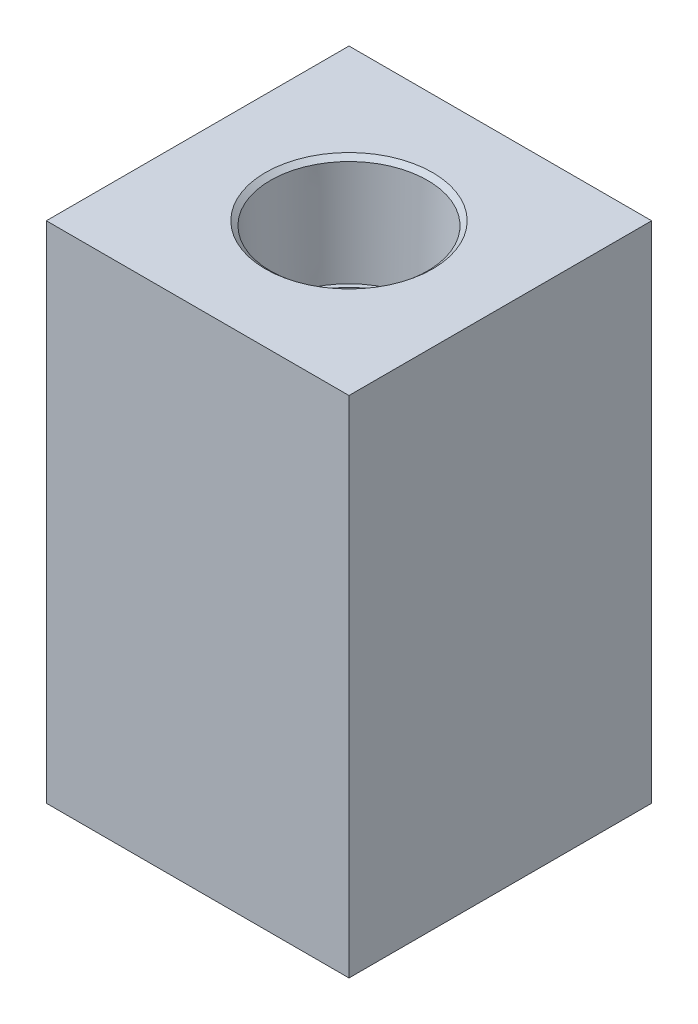
ISO-10303-21;
HEADER;
FILE_DESCRIPTION(('STEP AP214'),'2;1');
FILE_NAME('part.step','',(''),(''),'','','');
FILE_SCHEMA(('AUTOMOTIVE_DESIGN { 1 0 10303 214 1 1 1 1 }'));
ENDSEC;
DATA;
#1=APPLICATION_CONTEXT('core data for automotive mechanical design processes');
#2=APPLICATION_PROTOCOL_DEFINITION('international standard','automotive_design',2000,#1);
#3=PRODUCT_CONTEXT('',#1,'mechanical');
#4=PRODUCT('Part','Part','',(#3));
#5=PRODUCT_RELATED_PRODUCT_CATEGORY('part','',(#4));
#6=PRODUCT_DEFINITION_FORMATION('','',#4);
#7=PRODUCT_DEFINITION_CONTEXT('part definition',#1,'design');
#8=PRODUCT_DEFINITION('design','',#6,#7);
#9=PRODUCT_DEFINITION_SHAPE('','',#8);
#10=(LENGTH_UNIT() NAMED_UNIT(*) SI_UNIT(.MILLI.,.METRE.));
#11=(NAMED_UNIT(*) PLANE_ANGLE_UNIT() SI_UNIT($,.RADIAN.));
#12=(NAMED_UNIT(*) SI_UNIT($,.STERADIAN.) SOLID_ANGLE_UNIT());
#13=UNCERTAINTY_MEASURE_WITH_UNIT(LENGTH_MEASURE(1.E-05),#10,'distance_accuracy_value','');
#14=(GEOMETRIC_REPRESENTATION_CONTEXT(3) GLOBAL_UNCERTAINTY_ASSIGNED_CONTEXT((#13)) GLOBAL_UNIT_ASSIGNED_CONTEXT((#10,
#11,#12)) REPRESENTATION_CONTEXT('',''));
#15=CARTESIAN_POINT('',(0.,0.,0.));
#16=DIRECTION('',(0.,0.,1.));
#17=DIRECTION('',(1.,0.,0.));
#18=AXIS2_PLACEMENT_3D('',#15,#16,#17);
#19=CARTESIAN_POINT('',(-19.05,63.5,-19.05));
#20=DIRECTION('',(1.,0.,0.));
#21=DIRECTION('',(0.,0.,-1.));
#22=AXIS2_PLACEMENT_3D('',#19,#20,#21);
#23=PLANE('',#22);
#24=DIRECTION('',(0.,0.,1.));
#25=VECTOR('',#24,1.);
#26=CARTESIAN_POINT('',(-19.05,0.,-19.05));
#27=LINE('',#26,#25);
#28=CARTESIAN_POINT('',(-19.05,0.,-19.05));
#29=VERTEX_POINT('',#28);
#30=CARTESIAN_POINT('',(-19.05,0.,19.05));
#31=VERTEX_POINT('',#30);
#32=EDGE_CURVE('E123',#29,#31,#27,.T.);
#33=ORIENTED_EDGE('',*,*,#32,.T.);
#34=DIRECTION('',(0.,-1.,0.));
#35=VECTOR('',#34,1.);
#36=CARTESIAN_POINT('',(-19.05,63.5,19.05));
#37=LINE('',#36,#35);
#38=CARTESIAN_POINT('',(-19.05,63.5,19.05));
#39=VERTEX_POINT('',#38);
#40=EDGE_CURVE('E11',#39,#31,#37,.T.);
#41=ORIENTED_EDGE('',*,*,#40,.F.);
#42=DIRECTION('',(0.,0.,1.));
#43=VECTOR('',#42,1.);
#44=CARTESIAN_POINT('',(-19.05,63.5,-19.05));
#45=LINE('',#44,#43);
#46=CARTESIAN_POINT('',(-19.05,63.5,-19.05));
#47=VERTEX_POINT('',#46);
#48=EDGE_CURVE('E104',#47,#39,#45,.T.);
#49=ORIENTED_EDGE('',*,*,#48,.F.);
#50=DIRECTION('',(0.,-1.,0.));
#51=VECTOR('',#50,1.);
#52=CARTESIAN_POINT('',(-19.05,63.5,-19.05));
#53=LINE('',#52,#51);
#54=EDGE_CURVE('E71',#47,#29,#53,.T.);
#55=ORIENTED_EDGE('',*,*,#54,.T.);
#56=EDGE_LOOP('',(#33,#41,#49,#55));
#57=FACE_BOUND('',#56,.T.);
#58=ADVANCED_FACE('F48',(#57),#23,.F.);
#59=CARTESIAN_POINT('',(-19.05,63.5,19.05));
#60=DIRECTION('',(0.,0.,-1.));
#61=DIRECTION('',(-1.,0.,0.));
#62=AXIS2_PLACEMENT_3D('',#59,#60,#61);
#63=PLANE('',#62);
#64=DIRECTION('',(1.,0.,0.));
#65=VECTOR('',#64,1.);
#66=CARTESIAN_POINT('',(-19.05,0.,19.05));
#67=LINE('',#66,#65);
#68=CARTESIAN_POINT('',(19.05,0.,19.05));
#69=VERTEX_POINT('',#68);
#70=EDGE_CURVE('E110',#31,#69,#67,.T.);
#71=ORIENTED_EDGE('',*,*,#70,.T.);
#72=DIRECTION('',(0.,-1.,0.));
#73=VECTOR('',#72,1.);
#74=CARTESIAN_POINT('',(19.05,63.5,19.05));
#75=LINE('',#74,#73);
#76=CARTESIAN_POINT('',(19.05,63.5,19.05));
#77=VERTEX_POINT('',#76);
#78=EDGE_CURVE('E63',#77,#69,#75,.T.);
#79=ORIENTED_EDGE('',*,*,#78,.F.);
#80=DIRECTION('',(1.,0.,0.));
#81=VECTOR('',#80,1.);
#82=CARTESIAN_POINT('',(-19.05,63.5,19.05));
#83=LINE('',#82,#81);
#84=EDGE_CURVE('E96',#39,#77,#83,.T.);
#85=ORIENTED_EDGE('',*,*,#84,.F.);
#86=ORIENTED_EDGE('',*,*,#40,.T.);
#87=EDGE_LOOP('',(#71,#79,#85,#86));
#88=FACE_BOUND('',#87,.T.);
#89=ADVANCED_FACE('F109',(#88),#63,.F.);
#90=CARTESIAN_POINT('',(19.05,63.5,-19.05));
#91=DIRECTION('',(1.,0.,0.));
#92=DIRECTION('',(0.,0.,-1.));
#93=AXIS2_PLACEMENT_3D('',#90,#91,#92);
#94=PLANE('',#93);
#95=DIRECTION('',(0.,0.,1.));
#96=VECTOR('',#95,1.);
#97=CARTESIAN_POINT('',(19.05,0.,-19.05));
#98=LINE('',#97,#96);
#99=CARTESIAN_POINT('',(19.05,0.,-19.05));
#100=VERTEX_POINT('',#99);
#101=EDGE_CURVE('E129',#100,#69,#98,.T.);
#102=ORIENTED_EDGE('',*,*,#101,.F.);
#103=DIRECTION('',(0.,-1.,0.));
#104=VECTOR('',#103,1.);
#105=CARTESIAN_POINT('',(19.05,63.5,-19.05));
#106=LINE('',#105,#104);
#107=CARTESIAN_POINT('',(19.05,63.5,-19.05));
#108=VERTEX_POINT('',#107);
#109=EDGE_CURVE('E85',#108,#100,#106,.T.);
#110=ORIENTED_EDGE('',*,*,#109,.F.);
#111=DIRECTION('',(0.,0.,1.));
#112=VECTOR('',#111,1.);
#113=CARTESIAN_POINT('',(19.05,63.5,-19.05));
#114=LINE('',#113,#112);
#115=EDGE_CURVE('E103',#108,#77,#114,.T.);
#116=ORIENTED_EDGE('',*,*,#115,.T.);
#117=ORIENTED_EDGE('',*,*,#78,.T.);
#118=EDGE_LOOP('',(#102,#110,#116,#117));
#119=FACE_BOUND('',#118,.T.);
#120=ADVANCED_FACE('F115',(#119),#94,.T.);
#121=CARTESIAN_POINT('',(-19.05,63.5,-19.05));
#122=DIRECTION('',(0.,0.,-1.));
#123=DIRECTION('',(-1.,0.,0.));
#124=AXIS2_PLACEMENT_3D('',#121,#122,#123);
#125=PLANE('',#124);
#126=DIRECTION('',(1.,0.,0.));
#127=VECTOR('',#126,1.);
#128=CARTESIAN_POINT('',(-19.05,0.,-19.05));
#129=LINE('',#128,#127);
#130=EDGE_CURVE('E132',#29,#100,#129,.T.);
#131=ORIENTED_EDGE('',*,*,#130,.F.);
#132=ORIENTED_EDGE('',*,*,#54,.F.);
#133=DIRECTION('',(1.,0.,0.));
#134=VECTOR('',#133,1.);
#135=CARTESIAN_POINT('',(-19.05,63.5,-19.05));
#136=LINE('',#135,#134);
#137=EDGE_CURVE('E117',#47,#108,#136,.T.);
#138=ORIENTED_EDGE('',*,*,#137,.T.);
#139=ORIENTED_EDGE('',*,*,#109,.T.);
#140=EDGE_LOOP('',(#131,#132,#138,#139));
#141=FACE_BOUND('',#140,.T.);
#142=ADVANCED_FACE('F210',(#141),#125,.T.);
#143=CARTESIAN_POINT('',(0.,63.5,0.));
#144=DIRECTION('',(0.,1.,0.));
#145=DIRECTION('',(0.,0.,1.));
#146=AXIS2_PLACEMENT_3D('',#143,#144,#145);
#147=PLANE('',#146);
#148=CARTESIAN_POINT('',(0.,63.5,0.));
#149=DIRECTION('',(0.,1.,0.));
#150=DIRECTION('',(0.,0.,1.));
#151=AXIS2_PLACEMENT_3D('',#148,#149,#150);
#152=CIRCLE('',#151,10.5210229);
#153=CARTESIAN_POINT('',(0.,63.5,10.5210229));
#154=VERTEX_POINT('',#153);
#155=EDGE_CURVE('E157',#154,#154,#152,.T.);
#156=ORIENTED_EDGE('',*,*,#155,.F.);
#157=EDGE_LOOP('',(#156));
#158=FACE_BOUND('',#157,.T.);
#159=ORIENTED_EDGE('',*,*,#48,.T.);
#160=ORIENTED_EDGE('',*,*,#84,.T.);
#161=ORIENTED_EDGE('',*,*,#115,.F.);
#162=ORIENTED_EDGE('',*,*,#137,.F.);
#163=EDGE_LOOP('',(#159,#160,#161,#162));
#164=FACE_BOUND('',#163,.T.);
#165=ADVANCED_FACE('F100',(#158,#164),#147,.T.);
#166=CARTESIAN_POINT('',(0.,0.,0.));
#167=DIRECTION('',(0.,1.,0.));
#168=DIRECTION('',(0.,0.,1.));
#169=AXIS2_PLACEMENT_3D('',#166,#167,#168);
#170=PLANE('',#169);
#171=CARTESIAN_POINT('',(0.428891135840916,0.,-0.986449612433893));
#172=DIRECTION('',(0.,-1.,0.));
#173=DIRECTION('',(0.,0.,-1.));
#174=AXIS2_PLACEMENT_3D('',#171,#172,#173);
#175=CIRCLE('',#174,10.5210229);
#176=CARTESIAN_POINT('',(0.428891135840916,0.,-11.5074725124339));
#177=VERTEX_POINT('',#176);
#178=EDGE_CURVE('E177',#177,#177,#175,.T.);
#179=ORIENTED_EDGE('',*,*,#178,.F.);
#180=EDGE_LOOP('',(#179));
#181=FACE_BOUND('',#180,.T.);
#182=ORIENTED_EDGE('',*,*,#32,.F.);
#183=ORIENTED_EDGE('',*,*,#130,.T.);
#184=ORIENTED_EDGE('',*,*,#101,.T.);
#185=ORIENTED_EDGE('',*,*,#70,.F.);
#186=EDGE_LOOP('',(#182,#183,#184,#185));
#187=FACE_BOUND('',#186,.T.);
#188=ADVANCED_FACE('F209',(#181,#187),#170,.F.);
#189=CARTESIAN_POINT('',(0.,40.86,0.));
#190=DIRECTION('',(0.,1.,0.));
#191=DIRECTION('',(0.,0.,1.));
#192=AXIS2_PLACEMENT_3D('',#189,#190,#191);
#193=CONICAL_SURFACE('',#192,8.9281,1.02974425867665);
#194=CARTESIAN_POINT('',(0.,38.853065446386,0.));
#195=DIRECTION('',(0.,1.,0.));
#196=DIRECTION('',(0.,0.,1.));
#197=AXIS2_PLACEMENT_3D('',#194,#195,#196);
#198=CIRCLE('',#197,5.588);
#199=CARTESIAN_POINT('',(0.,38.853065446386,5.588));
#200=VERTEX_POINT('',#199);
#201=EDGE_CURVE('E181',#200,#200,#198,.F.);
#202=ORIENTED_EDGE('',*,*,#201,.T.);
#203=EDGE_LOOP('',(#202));
#204=FACE_BOUND('',#203,.T.);
#205=CARTESIAN_POINT('',(0.,40.86,0.));
#206=DIRECTION('',(0.,1.,0.));
#207=DIRECTION('',(0.,0.,1.));
#208=AXIS2_PLACEMENT_3D('',#205,#206,#207);
#209=CIRCLE('',#208,8.9281);
#210=CARTESIAN_POINT('',(0.,40.86,8.9281));
#211=VERTEX_POINT('',#210);
#212=EDGE_CURVE('E126',#211,#211,#209,.T.);
#213=ORIENTED_EDGE('',*,*,#212,.T.);
#214=EDGE_LOOP('',(#213));
#215=FACE_BOUND('',#214,.T.);
#216=ADVANCED_FACE('F222',(#204,#215),#193,.F.);
#217=CARTESIAN_POINT('',(0.,63.5,0.));
#218=DIRECTION('',(0.,1.,0.));
#219=DIRECTION('',(0.,0.,1.));
#220=AXIS2_PLACEMENT_3D('',#217,#218,#219);
#221=CYLINDRICAL_SURFACE('',#220,8.9281);
#222=ORIENTED_EDGE('',*,*,#212,.F.);
#223=EDGE_LOOP('',(#222));
#224=FACE_BOUND('',#223,.T.);
#225=CARTESIAN_POINT('',(0.,49.93,0.));
#226=DIRECTION('',(0.,1.,0.));
#227=DIRECTION('',(0.,0.,1.));
#228=AXIS2_PLACEMENT_3D('',#225,#226,#227);
#229=CIRCLE('',#228,8.9281);
#230=CARTESIAN_POINT('',(0.,49.93,8.9281));
#231=VERTEX_POINT('',#230);
#232=EDGE_CURVE('E145',#231,#231,#229,.T.);
#233=ORIENTED_EDGE('',*,*,#232,.T.);
#234=EDGE_LOOP('',(#233));
#235=FACE_BOUND('',#234,.T.);
#236=ADVANCED_FACE('F227',(#224,#235),#221,.F.);
#237=CARTESIAN_POINT('',(8.9281,49.93,0.));
#238=DIRECTION('',(0.,-1.,0.));
#239=DIRECTION('',(0.,0.,-1.));
#240=AXIS2_PLACEMENT_3D('',#237,#238,#239);
#241=PLANE('',#240);
#242=ORIENTED_EDGE('',*,*,#232,.F.);
#243=EDGE_LOOP('',(#242));
#244=FACE_BOUND('',#243,.T.);
#245=CARTESIAN_POINT('',(0.,49.93,0.));
#246=DIRECTION('',(0.,1.,0.));
#247=DIRECTION('',(0.,0.,1.));
#248=AXIS2_PLACEMENT_3D('',#245,#246,#247);
#249=CIRCLE('',#248,9.47901228571129);
#250=CARTESIAN_POINT('',(0.,49.93,9.47901228571129));
#251=VERTEX_POINT('',#250);
#252=EDGE_CURVE('E149',#251,#251,#249,.T.);
#253=ORIENTED_EDGE('',*,*,#252,.T.);
#254=EDGE_LOOP('',(#253));
#255=FACE_BOUND('',#254,.T.);
#256=ADVANCED_FACE('F230',(#244,#255),#241,.F.);
#257=CARTESIAN_POINT('',(0.,62.9671717342024,0.));
#258=DIRECTION('',(0.,1.,0.));
#259=DIRECTION('',(0.,0.,1.));
#260=AXIS2_PLACEMENT_3D('',#257,#258,#259);
#261=CONICAL_SURFACE('',#260,9.8860229,0.0312091050195367);
#262=ORIENTED_EDGE('',*,*,#252,.F.);
#263=EDGE_LOOP('',(#262));
#264=FACE_BOUND('',#263,.T.);
#265=CARTESIAN_POINT('',(0.,62.9671717342024,0.));
#266=DIRECTION('',(0.,1.,0.));
#267=DIRECTION('',(0.,0.,1.));
#268=AXIS2_PLACEMENT_3D('',#265,#266,#267);
#269=CIRCLE('',#268,9.8860229);
#270=CARTESIAN_POINT('',(0.,62.9671717342024,9.8860229));
#271=VERTEX_POINT('',#270);
#272=EDGE_CURVE('E153',#271,#271,#269,.T.);
#273=ORIENTED_EDGE('',*,*,#272,.T.);
#274=EDGE_LOOP('',(#273));
#275=FACE_BOUND('',#274,.T.);
#276=ADVANCED_FACE('F234',(#264,#275),#261,.F.);
#277=CARTESIAN_POINT('',(0.,63.5,0.));
#278=DIRECTION('',(0.,1.,0.));
#279=DIRECTION('',(0.,0.,1.));
#280=AXIS2_PLACEMENT_3D('',#277,#278,#279);
#281=CONICAL_SURFACE('',#280,10.5210229,0.872664625997173);
#282=ORIENTED_EDGE('',*,*,#272,.F.);
#283=EDGE_LOOP('',(#282));
#284=FACE_BOUND('',#283,.T.);
#285=ORIENTED_EDGE('',*,*,#155,.T.);
#286=EDGE_LOOP('',(#285));
#287=FACE_BOUND('',#286,.T.);
#288=ADVANCED_FACE('F238',(#284,#287),#281,.F.);
#289=CARTESIAN_POINT('',(0.428891135840916,22.64,-0.986449612433893));
#290=DIRECTION('',(0.,-1.,0.));
#291=DIRECTION('',(0.,0.,-1.));
#292=AXIS2_PLACEMENT_3D('',#289,#290,#291);
#293=CONICAL_SURFACE('',#292,8.9281,1.02974425867665);
#294=CARTESIAN_POINT('',(-4.63287347238184,24.7029508021243,-3.12445633493263));
#295=CARTESIAN_POINT('',(-4.72119931703171,24.6846810589887,-2.99349070344428));
#296=CARTESIAN_POINT('',(-4.80395806692851,24.6664217810283,-2.85879152360528));
#297=CARTESIAN_POINT('',(-4.95780242240061,24.630039334,-2.58280825472859));
#298=CARTESIAN_POINT('',(-5.02888493804159,24.6119162021681,-2.44152243529736));
#299=CARTESIAN_POINT('',(-5.1588901431234,24.5759152827791,-2.15328059854045));
#300=CARTESIAN_POINT('',(-5.21780185970718,24.5580377300655,-2.00631960506851));
#301=CARTESIAN_POINT('',(-5.32297782970068,24.522650350804,-1.70783434193703));
#302=CARTESIAN_POINT('',(-5.36923745539913,24.505140660964,-1.55630842501802));
#303=CARTESIAN_POINT('',(-5.44869863477368,24.470618930905,-1.24997644518862));
#304=CARTESIAN_POINT('',(-5.4819130144463,24.4536064171795,-1.09517376263126));
#305=CARTESIAN_POINT('',(-5.53510682784439,24.4201539188507,-0.783189833114002));
#306=CARTESIAN_POINT('',(-5.5550813659688,24.4037141481529,-0.626007728281086));
#307=CARTESIAN_POINT('',(-5.58160769382882,24.3715165789325,-0.310545951566981));
#308=CARTESIAN_POINT('',(-5.58816791816526,24.3557583579737,-0.15226703220398));
#309=CARTESIAN_POINT('',(-5.58782548649317,24.3249932691332,0.164408788889521));
#310=CARTESIAN_POINT('',(-5.5809178769784,24.3099866797861,0.322805712602575));
#311=CARTESIAN_POINT('',(-5.55371140078594,24.2808654210832,0.637926922179981));
#312=CARTESIAN_POINT('',(-5.53346262378916,24.2667476310875,0.794655244835156));
#313=CARTESIAN_POINT('',(-5.47973874406532,24.2394108682871,1.10596876699654));
#314=CARTESIAN_POINT('',(-5.44625875679282,24.2261922295355,1.26055315318936));
#315=CARTESIAN_POINT('',(-5.36630788342717,24.2007306918199,1.56634950765982));
#316=CARTESIAN_POINT('',(-5.31984154721438,24.1884874530434,1.71756263708743));
#317=CARTESIAN_POINT('',(-5.21420962092554,24.1650278302882,2.01563197215979));
#318=CARTESIAN_POINT('',(-5.15503936631424,24.1538118256459,2.16248655485983));
#319=CARTESIAN_POINT('',(-5.02477668054101,24.1325248472953,2.44992301220485));
#320=CARTESIAN_POINT('',(-4.95375125556773,24.1224479441157,2.590534812506));
#321=CARTESIAN_POINT('',(-4.80002235572563,24.1034132869526,2.86536807758644));
#322=CARTESIAN_POINT('',(-4.71731458315352,24.0944559471301,2.99958716620621));
#323=CARTESIAN_POINT('',(-4.5408435262171,24.0777098357331,3.26056334607985));
#324=CARTESIAN_POINT('',(-4.44708460939965,24.0699206052546,3.38732335575506));
#325=CARTESIAN_POINT('',(-4.24915704803744,24.0555413150177,3.63253113474518));
#326=CARTESIAN_POINT('',(-4.14498458502665,24.0489516976535,3.75097582767761));
#327=CARTESIAN_POINT('',(-3.81903259208929,24.0310956288377,4.09131274301237));
#328=CARTESIAN_POINT('',(-3.58276611726926,24.0216429149068,4.29976021004276));
#329=CARTESIAN_POINT('',(-3.07864786162345,24.0078012297677,4.6740093321045));
#330=CARTESIAN_POINT('',(-2.81079676770594,24.003412148457,4.8398119143355));
#331=CARTESIAN_POINT('',(-2.25188397028126,23.9997718178714,5.12373369264331));
#332=CARTESIAN_POINT('',(-1.96089666552612,24.0005047098379,5.24199887337445));
#333=CARTESIAN_POINT('',(-1.36330423261013,24.0070604333587,5.42817752575535));
#334=CARTESIAN_POINT('',(-1.05669920890705,24.0128832308739,5.49609133412868));
#335=CARTESIAN_POINT('',(-0.436764762949795,24.0295091783347,5.57967235985752));
#336=CARTESIAN_POINT('',(-0.123439369204057,24.0403094199583,5.59537004315368));
#337=CARTESIAN_POINT('',(0.501228624672369,24.0666951191743,5.57424280951532));
#338=CARTESIAN_POINT('',(0.812571213081028,24.0822806050294,5.53741758236275));
#339=CARTESIAN_POINT('',(1.42512725976481,24.1179891137444,5.4122710869602));
#340=CARTESIAN_POINT('',(1.72631849841361,24.1381214304931,5.3238437473526));
#341=CARTESIAN_POINT('',(2.30942800216225,24.1825280787033,5.09804313474878));
#342=CARTESIAN_POINT('',(2.59134590213672,24.2068024886046,4.96066893478077));
#343=CARTESIAN_POINT('',(3.12916895644648,24.2591339393408,4.6403043199451));
#344=CARTESIAN_POINT('',(3.38496049425962,24.2872063620733,4.45712569623176));
#345=CARTESIAN_POINT('',(3.86205371211144,24.3464865054196,4.0507389649552));
#346=CARTESIAN_POINT('',(4.08335446867251,24.3776943099454,3.82752978593304));
#347=CARTESIAN_POINT('',(4.48638606814864,24.4427472159463,3.34620882770556));
#348=CARTESIAN_POINT('',(4.66790733963246,24.4766050671944,3.08792328489628));
#349=CARTESIAN_POINT('',(4.9848937281512,24.5460395140189,2.54469666910475));
#350=CARTESIAN_POINT('',(5.12035757586901,24.5816161569333,2.25975486176651));
#351=CARTESIAN_POINT('',(5.34197542688445,24.6537675299524,1.66994818891758));
#352=CARTESIAN_POINT('',(5.42790740694954,24.6903459958499,1.36500033868188));
#353=CARTESIAN_POINT('',(5.54711195858765,24.7633488513791,0.74495841120633));
#354=CARTESIAN_POINT('',(5.58038358938392,24.7997732382466,0.429864152803588));
#355=CARTESIAN_POINT('',(5.59329582701184,24.8714296764373,-0.20212613578694));
#356=CARTESIAN_POINT('',(5.57284174770684,24.9066595116924,-0.519024363533392));
#357=CARTESIAN_POINT('',(5.47857429716376,24.9746647557762,-1.14506079150666));
#358=CARTESIAN_POINT('',(5.40476115213373,25.0074401750093,-1.45419902462511));
#359=CARTESIAN_POINT('',(5.20599383983389,25.0692064044832,-2.05505376979349));
#360=CARTESIAN_POINT('',(5.08117659774058,25.0982070756417,-2.3468145488639));
#361=CARTESIAN_POINT('',(4.78377737226353,25.1512938862041,-2.90539062348317));
#362=CARTESIAN_POINT('',(4.61119726011504,25.1753802180758,-3.17220689575052));
#363=CARTESIAN_POINT('',(4.22454763761001,25.2173477082502,-3.67122736294488));
#364=CARTESIAN_POINT('',(4.01078992978955,25.2352728452627,-3.90366982112204));
#365=CARTESIAN_POINT('',(3.54680296582795,25.2642480807969,-4.32954131684784));
#366=CARTESIAN_POINT('',(3.29657573398211,25.2752985607275,-4.52297251835482));
#367=CARTESIAN_POINT('',(2.90083471491683,25.2862393562613,-4.77864214562236));
#368=CARTESIAN_POINT('',(2.7660821432602,25.2889473920624,-4.85787788710662));
#369=CARTESIAN_POINT('',(2.49041153213915,25.2924978920813,-5.00479164372815));
#370=CARTESIAN_POINT('',(2.34949584485529,25.2933410618058,-5.07247402073021));
#371=CARTESIAN_POINT('',(2.06245156494348,25.293148828594,-5.19581191537475));
#372=CARTESIAN_POINT('',(1.91632119176065,25.292112777863,-5.25146327834991));
#373=CARTESIAN_POINT('',(1.61998698741796,25.2881767962273,-5.35030546410771));
#374=CARTESIAN_POINT('',(1.46978468264793,25.2852775547456,-5.39350088731079));
#375=CARTESIAN_POINT('',(1.16691147426895,25.2776697768978,-5.46701520144508));
#376=CARTESIAN_POINT('',(1.01425209169991,25.2729681432265,-5.49738230016229));
#377=CARTESIAN_POINT('',(0.707051832767542,25.2618198372264,-5.54526633153561));
#378=CARTESIAN_POINT('',(0.552511667770785,25.2553738062203,-5.56278797802244));
#379=CARTESIAN_POINT('',(0.242535758884382,25.2408173885008,-5.58489678573873));
#380=CARTESIAN_POINT('',(0.0870997345557871,25.2327064496372,-5.58947964848911));
#381=CARTESIAN_POINT('',(-0.22346807921618,25.2149270292451,-5.58568834476769));
#382=CARTESIAN_POINT('',(-0.378599957762104,25.2052591072301,-5.5773188235633));
#383=CARTESIAN_POINT('',(-0.688159692605329,25.1844386838498,-5.54765309745385));
#384=CARTESIAN_POINT('',(-0.842582145482611,25.1732803230816,-5.52630462706612));
#385=CARTESIAN_POINT('',(-1.14895148390394,25.1496442091982,-5.47082089762869));
#386=CARTESIAN_POINT('',(-1.30089923498821,25.1371669293383,-5.43669021399742));
#387=CARTESIAN_POINT('',(-1.60141909758736,25.1110201839104,-5.35587779858429));
#388=CARTESIAN_POINT('',(-1.74998898839101,25.097349961092,-5.30918805489376));
#389=CARTESIAN_POINT('',(-2.04257567160699,25.0689738954418,-5.20363408297406));
#390=CARTESIAN_POINT('',(-2.18659406141852,25.0542684219245,-5.1447741819473));
#391=CARTESIAN_POINT('',(-2.47048076212148,25.0238215886692,-5.01468605096647));
#392=CARTESIAN_POINT('',(-2.61029712031773,25.0080717670327,-4.94334640435261));
#393=CARTESIAN_POINT('',(-2.8833215167102,24.975819956238,-4.78923445958844));
#394=CARTESIAN_POINT('',(-3.01653186785704,24.9593182342803,-4.70646620188366));
#395=CARTESIAN_POINT('',(-3.27536788604746,24.9257213624654,-4.53014429702843));
#396=CARTESIAN_POINT('',(-3.40099991084063,24.9086267295367,-4.43659988767217));
#397=CARTESIAN_POINT('',(-3.64389676274479,24.873983100035,-4.23936731241254));
#398=CARTESIAN_POINT('',(-3.76116371567453,24.856434220456,-4.13568173968256));
#399=CARTESIAN_POINT('',(-4.01582420008614,24.8164211227796,-3.89071682801267));
#400=CARTESIAN_POINT('',(-4.15054870565744,24.7938626147102,-3.74666216384549));
#401=CARTESIAN_POINT('',(-4.40402344601649,24.7485142525994,-3.44515758513409));
#402=CARTESIAN_POINT('',(-4.52277356676022,24.7257243969078,-3.28770757497117));
#403=CARTESIAN_POINT('',(-4.63287347238184,24.7029508021243,-3.12445633493263));
#404=B_SPLINE_CURVE_WITH_KNOTS('',3,(#294,#295,#296,#297,#298,#299,#300,#301,#302,#303,#304,
#305,#306,#307,#308,#309,#310,#311,#312,#313,#314,#315,#316,#317,#318,#319,#320,#321,#322,#323,
#324,#325,#326,#327,#328,#329,#330,#331,#332,#333,#334,#335,#336,#337,#338,#339,#340,#341,#342,
#343,#344,#345,#346,#347,#348,#349,#350,#351,#352,#353,#354,#355,#356,#357,#358,#359,#360,#361,
#362,#363,#364,#365,#366,#367,#368,#369,#370,#371,#372,#373,#374,#375,#376,#377,#378,#379,#380,
#381,#382,#383,#384,#385,#386,#387,#388,#389,#390,#391,#392,#393,#394,#395,#396,#397,#398,#399,
#400,#401,#402,#403),.UNSPECIFIED.,.T.,.F.,(4,2,2,2,2,2,2,2,2,2,2,2,2,2,2,2,2,2,2,2,2,2,2,2,2,2,
2,2,2,2,2,2,2,2,2,2,2,2,2,2,2,2,2,2,2,2,2,2,2,2,2,2,2,2,4),(0.,0.476885912328818,
0.953897822510703,1.43133793456582,1.90895244539411,2.38609618629566,2.86341625893365,
3.34043611168042,3.81763144673529,4.29304527463807,4.76863477452259,5.24405785592374,
5.71965579926668,6.19265141003915,6.66582148189101,7.13880517426191,7.61196294216952,
8.55271590814706,9.49344841822294,10.431269506326,11.3690843227167,12.3063518670389,
13.2436249472029,14.1828314711637,15.1220557830727,16.065204644325,17.0083787536943,
17.9564083374509,18.9044640462603,19.8567369495758,20.8090268650478,21.7629962209166,
22.7169615325937,23.668382488365,24.6197661750096,25.5642105299406,26.5086024820304,
26.9771805301689,27.4455812778848,27.9141435208542,28.3825324848614,28.849145277083,
29.315586752938,29.7821831701828,30.2486122851848,30.716932240679,31.1850847200982,
31.6535365632452,32.1218221299208,32.5945243544467,33.067059886748,33.5391933135006,
34.0112063261814,34.6056497682682,35.2000974539689),.UNSPECIFIED.);
#405=CARTESIAN_POINT('',(-4.63287347238184,24.7029508021243,-3.12445633493263));
#406=VERTEX_POINT('',#405);
#407=EDGE_CURVE('E51',#406,#406,#404,.T.);
#408=ORIENTED_EDGE('',*,*,#407,.T.);
#409=EDGE_LOOP('',(#408));
#410=FACE_BOUND('',#409,.T.);
#411=CARTESIAN_POINT('',(0.428891135840916,22.64,-0.986449612433893));
#412=DIRECTION('',(0.,-1.,0.));
#413=DIRECTION('',(0.,0.,-1.));
#414=AXIS2_PLACEMENT_3D('',#411,#412,#413);
#415=CIRCLE('',#414,8.9281);
#416=CARTESIAN_POINT('',(0.428891135840916,22.64,-9.91454961243389));
#417=VERTEX_POINT('',#416);
#418=EDGE_CURVE('E161',#417,#417,#415,.T.);
#419=ORIENTED_EDGE('',*,*,#418,.T.);
#420=EDGE_LOOP('',(#419));
#421=FACE_BOUND('',#420,.T.);
#422=ADVANCED_FACE('F190',(#410,#421),#293,.F.);
#423=CARTESIAN_POINT('',(0.428891135840916,0.,-0.986449612433893));
#424=DIRECTION('',(0.,-1.,0.));
#425=DIRECTION('',(0.,0.,-1.));
#426=AXIS2_PLACEMENT_3D('',#423,#424,#425);
#427=CYLINDRICAL_SURFACE('',#426,8.9281);
#428=ORIENTED_EDGE('',*,*,#418,.F.);
#429=EDGE_LOOP('',(#428));
#430=FACE_BOUND('',#429,.T.);
#431=CARTESIAN_POINT('',(0.428891135840916,13.57,-0.986449612433893));
#432=DIRECTION('',(0.,-1.,0.));
#433=DIRECTION('',(0.,0.,-1.));
#434=AXIS2_PLACEMENT_3D('',#431,#432,#433);
#435=CIRCLE('',#434,8.9281);
#436=CARTESIAN_POINT('',(0.428891135840916,13.57,-9.91454961243389));
#437=VERTEX_POINT('',#436);
#438=EDGE_CURVE('E165',#437,#437,#435,.T.);
#439=ORIENTED_EDGE('',*,*,#438,.T.);
#440=EDGE_LOOP('',(#439));
#441=FACE_BOUND('',#440,.T.);
#442=ADVANCED_FACE('F244',(#430,#441),#427,.F.);
#443=CARTESIAN_POINT('',(9.35699113584092,13.57,-0.986449612433893));
#444=DIRECTION('',(0.,1.,0.));
#445=DIRECTION('',(0.,0.,1.));
#446=AXIS2_PLACEMENT_3D('',#443,#444,#445);
#447=PLANE('',#446);
#448=ORIENTED_EDGE('',*,*,#438,.F.);
#449=EDGE_LOOP('',(#448));
#450=FACE_BOUND('',#449,.T.);
#451=CARTESIAN_POINT('',(0.428891135840916,13.57,-0.986449612433893));
#452=DIRECTION('',(0.,-1.,0.));
#453=DIRECTION('',(0.,0.,-1.));
#454=AXIS2_PLACEMENT_3D('',#451,#452,#453);
#455=CIRCLE('',#454,9.47901228571129);
#456=CARTESIAN_POINT('',(0.428891135840916,13.57,-10.4654618981452));
#457=VERTEX_POINT('',#456);
#458=EDGE_CURVE('E169',#457,#457,#455,.T.);
#459=ORIENTED_EDGE('',*,*,#458,.T.);
#460=EDGE_LOOP('',(#459));
#461=FACE_BOUND('',#460,.T.);
#462=ADVANCED_FACE('F247',(#450,#461),#447,.F.);
#463=CARTESIAN_POINT('',(0.428891135840916,0.532828265797572,-0.986449612433893));
#464=DIRECTION('',(0.,-1.,0.));
#465=DIRECTION('',(0.,0.,-1.));
#466=AXIS2_PLACEMENT_3D('',#463,#464,#465);
#467=CONICAL_SURFACE('',#466,9.8860229,0.0312091050195368);
#468=ORIENTED_EDGE('',*,*,#458,.F.);
#469=EDGE_LOOP('',(#468));
#470=FACE_BOUND('',#469,.T.);
#471=CARTESIAN_POINT('',(0.428891135840916,0.532828265797572,-0.986449612433893));
#472=DIRECTION('',(0.,-1.,0.));
#473=DIRECTION('',(0.,0.,-1.));
#474=AXIS2_PLACEMENT_3D('',#471,#472,#473);
#475=CIRCLE('',#474,9.8860229);
#476=CARTESIAN_POINT('',(0.428891135840916,0.532828265797572,-10.8724725124339));
#477=VERTEX_POINT('',#476);
#478=EDGE_CURVE('E173',#477,#477,#475,.T.);
#479=ORIENTED_EDGE('',*,*,#478,.T.);
#480=EDGE_LOOP('',(#479));
#481=FACE_BOUND('',#480,.T.);
#482=ADVANCED_FACE('F201',(#470,#481),#467,.F.);
#483=CARTESIAN_POINT('',(0.428891135840916,0.,-0.986449612433893));
#484=DIRECTION('',(0.,-1.,0.));
#485=DIRECTION('',(0.,0.,-1.));
#486=AXIS2_PLACEMENT_3D('',#483,#484,#485);
#487=CONICAL_SURFACE('',#486,10.5210229,0.872664625997165);
#488=ORIENTED_EDGE('',*,*,#478,.F.);
#489=EDGE_LOOP('',(#488));
#490=FACE_BOUND('',#489,.T.);
#491=ORIENTED_EDGE('',*,*,#178,.T.);
#492=EDGE_LOOP('',(#491));
#493=FACE_BOUND('',#492,.T.);
#494=ADVANCED_FACE('F196',(#490,#493),#487,.F.);
#495=CARTESIAN_POINT('',(0.,0.,0.));
#496=DIRECTION('',(0.,1.,0.));
#497=DIRECTION('',(0.,0.,1.));
#498=AXIS2_PLACEMENT_3D('',#495,#496,#497);
#499=CYLINDRICAL_SURFACE('',#498,5.588);
#500=ORIENTED_EDGE('',*,*,#407,.F.);
#501=EDGE_LOOP('',(#500));
#502=FACE_BOUND('',#501,.T.);
#503=ORIENTED_EDGE('',*,*,#201,.F.);
#504=EDGE_LOOP('',(#503));
#505=FACE_BOUND('',#504,.T.);
#506=ADVANCED_FACE('F193',(#502,#505),#499,.F.);
#507=CLOSED_SHELL('',(#58,#89,#120,#142,#165,#188,#216,#236,#256,#276,#288,#422,#442,#462,#482,
#494,#506));
#508=MANIFOLD_SOLID_BREP('B2',#507);
#509=ADVANCED_BREP_SHAPE_REPRESENTATION('',(#18,#508),#14);
#510=SHAPE_DEFINITION_REPRESENTATION(#9,#509);
ENDSEC;
END-ISO-10303-21;
